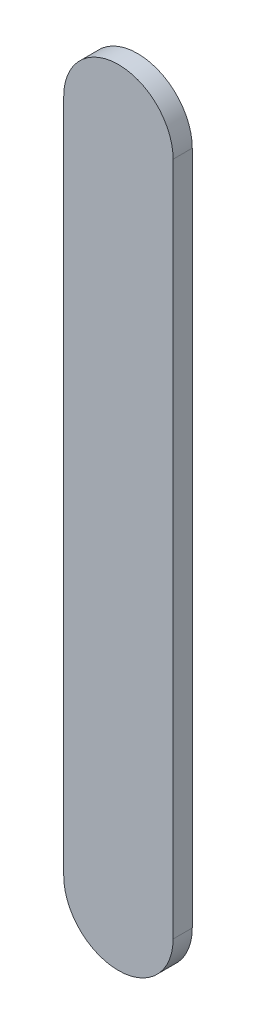
ISO-10303-21;
HEADER;
FILE_DESCRIPTION(('STEP AP214'),'2;1');
FILE_NAME('part.step','',(''),(''),'','','');
FILE_SCHEMA(('AUTOMOTIVE_DESIGN { 1 0 10303 214 1 1 1 1 }'));
ENDSEC;
DATA;
#1=APPLICATION_CONTEXT('core data for automotive mechanical design processes');
#2=APPLICATION_PROTOCOL_DEFINITION('international standard','automotive_design',2000,#1);
#3=PRODUCT_CONTEXT('',#1,'mechanical');
#4=PRODUCT('Part','Part','',(#3));
#5=PRODUCT_RELATED_PRODUCT_CATEGORY('part','',(#4));
#6=PRODUCT_DEFINITION_FORMATION('','',#4);
#7=PRODUCT_DEFINITION_CONTEXT('part definition',#1,'design');
#8=PRODUCT_DEFINITION('design','',#6,#7);
#9=PRODUCT_DEFINITION_SHAPE('','',#8);
#10=(LENGTH_UNIT() NAMED_UNIT(*) SI_UNIT(.MILLI.,.METRE.));
#11=(NAMED_UNIT(*) PLANE_ANGLE_UNIT() SI_UNIT($,.RADIAN.));
#12=(NAMED_UNIT(*) SI_UNIT($,.STERADIAN.) SOLID_ANGLE_UNIT());
#13=UNCERTAINTY_MEASURE_WITH_UNIT(LENGTH_MEASURE(1.E-05),#10,'distance_accuracy_value','');
#14=(GEOMETRIC_REPRESENTATION_CONTEXT(3) GLOBAL_UNCERTAINTY_ASSIGNED_CONTEXT((#13)) GLOBAL_UNIT_ASSIGNED_CONTEXT((#10,
#11,#12)) REPRESENTATION_CONTEXT('',''));
#15=CARTESIAN_POINT('',(0.,0.,0.));
#16=DIRECTION('',(0.,0.,1.));
#17=DIRECTION('',(1.,0.,0.));
#18=AXIS2_PLACEMENT_3D('',#15,#16,#17);
#19=CARTESIAN_POINT('',(82.95,-135.815,1.635));
#20=DIRECTION('',(0.,0.,1.));
#21=DIRECTION('',(1.,0.,0.));
#22=AXIS2_PLACEMENT_3D('',#19,#20,#21);
#23=PLANE('',#22);
#24=DIRECTION('',(0.,-1.,0.));
#25=VECTOR('',#24,1.);
#26=CARTESIAN_POINT('',(82.95,-135.815,1.635));
#27=LINE('',#26,#25);
#28=CARTESIAN_POINT('',(82.95,-135.815,1.635));
#29=VERTEX_POINT('',#28);
#30=CARTESIAN_POINT('',(82.95,-137.05,1.635));
#31=VERTEX_POINT('',#30);
#32=EDGE_CURVE('E82',#29,#31,#27,.T.);
#33=ORIENTED_EDGE('',*,*,#32,.T.);
#34=CARTESIAN_POINT('',(83.05,-137.05,1.635));
#35=DIRECTION('',(0.,0.,1.));
#36=DIRECTION('',(-1.,0.,0.));
#37=AXIS2_PLACEMENT_3D('',#34,#35,#36);
#38=CIRCLE('',#37,0.1);
#39=CARTESIAN_POINT('',(83.15,-137.05,1.635));
#40=VERTEX_POINT('',#39);
#41=EDGE_CURVE('E108',#31,#40,#38,.T.);
#42=ORIENTED_EDGE('',*,*,#41,.T.);
#43=DIRECTION('',(0.,1.,0.));
#44=VECTOR('',#43,1.);
#45=CARTESIAN_POINT('',(83.15,-137.05,1.635));
#46=LINE('',#45,#44);
#47=CARTESIAN_POINT('',(83.15,-135.815,1.635));
#48=VERTEX_POINT('',#47);
#49=EDGE_CURVE('E75',#40,#48,#46,.T.);
#50=ORIENTED_EDGE('',*,*,#49,.T.);
#51=CARTESIAN_POINT('',(83.05,-135.815,1.635));
#52=DIRECTION('',(0.,0.,1.));
#53=DIRECTION('',(1.,0.,0.));
#54=AXIS2_PLACEMENT_3D('',#51,#52,#53);
#55=CIRCLE('',#54,0.1);
#56=EDGE_CURVE('E11',#48,#29,#55,.T.);
#57=ORIENTED_EDGE('',*,*,#56,.T.);
#58=EDGE_LOOP('',(#33,#42,#50,#57));
#59=FACE_BOUND('',#58,.T.);
#60=ADVANCED_FACE('F17',(#59),#23,.T.);
#61=CARTESIAN_POINT('',(82.95,-135.815,1.6));
#62=DIRECTION('',(0.,0.,1.));
#63=DIRECTION('',(1.,0.,0.));
#64=AXIS2_PLACEMENT_3D('',#61,#62,#63);
#65=PLANE('',#64);
#66=CARTESIAN_POINT('',(83.05,-135.815,1.6));
#67=DIRECTION('',(0.,0.,1.));
#68=DIRECTION('',(1.,0.,0.));
#69=AXIS2_PLACEMENT_3D('',#66,#67,#68);
#70=CIRCLE('',#69,0.1);
#71=CARTESIAN_POINT('',(83.15,-135.815,1.6));
#72=VERTEX_POINT('',#71);
#73=CARTESIAN_POINT('',(82.95,-135.815,1.6));
#74=VERTEX_POINT('',#73);
#75=EDGE_CURVE('E20',#72,#74,#70,.T.);
#76=ORIENTED_EDGE('',*,*,#75,.F.);
#77=DIRECTION('',(0.,1.,0.));
#78=VECTOR('',#77,1.);
#79=CARTESIAN_POINT('',(83.15,-137.05,1.6));
#80=LINE('',#79,#78);
#81=CARTESIAN_POINT('',(83.15,-137.05,1.6));
#82=VERTEX_POINT('',#81);
#83=EDGE_CURVE('E111',#82,#72,#80,.T.);
#84=ORIENTED_EDGE('',*,*,#83,.F.);
#85=CARTESIAN_POINT('',(83.05,-137.05,1.6));
#86=DIRECTION('',(0.,0.,1.));
#87=DIRECTION('',(-1.,0.,0.));
#88=AXIS2_PLACEMENT_3D('',#85,#86,#87);
#89=CIRCLE('',#88,0.1);
#90=CARTESIAN_POINT('',(82.95,-137.05,1.6));
#91=VERTEX_POINT('',#90);
#92=EDGE_CURVE('E84',#91,#82,#89,.T.);
#93=ORIENTED_EDGE('',*,*,#92,.F.);
#94=DIRECTION('',(0.,-1.,0.));
#95=VECTOR('',#94,1.);
#96=CARTESIAN_POINT('',(82.95,-135.815,1.6));
#97=LINE('',#96,#95);
#98=EDGE_CURVE('E80',#74,#91,#97,.T.);
#99=ORIENTED_EDGE('',*,*,#98,.F.);
#100=EDGE_LOOP('',(#76,#84,#93,#99));
#101=FACE_BOUND('',#100,.T.);
#102=ADVANCED_FACE('F86',(#101),#65,.F.);
#103=CARTESIAN_POINT('',(83.05,-135.815,1.6));
#104=DIRECTION('',(0.,0.,-1.));
#105=DIRECTION('',(1.,0.,0.));
#106=AXIS2_PLACEMENT_3D('',#103,#104,#105);
#107=CYLINDRICAL_SURFACE('',#106,0.1);
#108=ORIENTED_EDGE('',*,*,#75,.T.);
#109=DIRECTION('',(0.,0.,1.));
#110=VECTOR('',#109,1.);
#111=CARTESIAN_POINT('',(82.95,-135.815,1.6));
#112=LINE('',#111,#110);
#113=EDGE_CURVE('E69',#74,#29,#112,.T.);
#114=ORIENTED_EDGE('',*,*,#113,.T.);
#115=ORIENTED_EDGE('',*,*,#56,.F.);
#116=DIRECTION('',(0.,0.,1.));
#117=VECTOR('',#116,1.);
#118=CARTESIAN_POINT('',(83.15,-135.815,1.6));
#119=LINE('',#118,#117);
#120=EDGE_CURVE('E72',#72,#48,#119,.T.);
#121=ORIENTED_EDGE('',*,*,#120,.F.);
#122=EDGE_LOOP('',(#108,#114,#115,#121));
#123=FACE_BOUND('',#122,.T.);
#124=ADVANCED_FACE('F68',(#123),#107,.T.);
#125=CARTESIAN_POINT('',(83.15,-137.05,1.6));
#126=DIRECTION('',(-1.,0.,0.));
#127=DIRECTION('',(0.,0.,1.));
#128=AXIS2_PLACEMENT_3D('',#125,#126,#127);
#129=PLANE('',#128);
#130=ORIENTED_EDGE('',*,*,#83,.T.);
#131=ORIENTED_EDGE('',*,*,#120,.T.);
#132=ORIENTED_EDGE('',*,*,#49,.F.);
#133=DIRECTION('',(0.,0.,1.));
#134=VECTOR('',#133,1.);
#135=CARTESIAN_POINT('',(83.15,-137.05,1.6));
#136=LINE('',#135,#134);
#137=EDGE_CURVE('E104',#82,#40,#136,.T.);
#138=ORIENTED_EDGE('',*,*,#137,.F.);
#139=EDGE_LOOP('',(#130,#131,#132,#138));
#140=FACE_BOUND('',#139,.T.);
#141=ADVANCED_FACE('F118',(#140),#129,.F.);
#142=CARTESIAN_POINT('',(83.05,-137.05,1.6));
#143=DIRECTION('',(0.,0.,-1.));
#144=DIRECTION('',(-1.,0.,0.));
#145=AXIS2_PLACEMENT_3D('',#142,#143,#144);
#146=CYLINDRICAL_SURFACE('',#145,0.1);
#147=ORIENTED_EDGE('',*,*,#92,.T.);
#148=ORIENTED_EDGE('',*,*,#137,.T.);
#149=ORIENTED_EDGE('',*,*,#41,.F.);
#150=DIRECTION('',(0.,0.,1.));
#151=VECTOR('',#150,1.);
#152=CARTESIAN_POINT('',(82.95,-137.05,1.6));
#153=LINE('',#152,#151);
#154=EDGE_CURVE('E90',#91,#31,#153,.T.);
#155=ORIENTED_EDGE('',*,*,#154,.F.);
#156=EDGE_LOOP('',(#147,#148,#149,#155));
#157=FACE_BOUND('',#156,.T.);
#158=ADVANCED_FACE('F121',(#157),#146,.T.);
#159=CARTESIAN_POINT('',(82.95,-135.815,1.6));
#160=DIRECTION('',(1.,0.,0.));
#161=DIRECTION('',(0.,1.,0.));
#162=AXIS2_PLACEMENT_3D('',#159,#160,#161);
#163=PLANE('',#162);
#164=ORIENTED_EDGE('',*,*,#98,.T.);
#165=ORIENTED_EDGE('',*,*,#154,.T.);
#166=ORIENTED_EDGE('',*,*,#32,.F.);
#167=ORIENTED_EDGE('',*,*,#113,.F.);
#168=EDGE_LOOP('',(#164,#165,#166,#167));
#169=FACE_BOUND('',#168,.T.);
#170=ADVANCED_FACE('F78',(#169),#163,.F.);
#171=CLOSED_SHELL('',(#60,#102,#124,#141,#158,#170));
#172=MANIFOLD_SOLID_BREP('B1',#171);
#173=ADVANCED_BREP_SHAPE_REPRESENTATION('',(#18,#172),#14);
#174=SHAPE_DEFINITION_REPRESENTATION(#9,#173);
ENDSEC;
END-ISO-10303-21;
